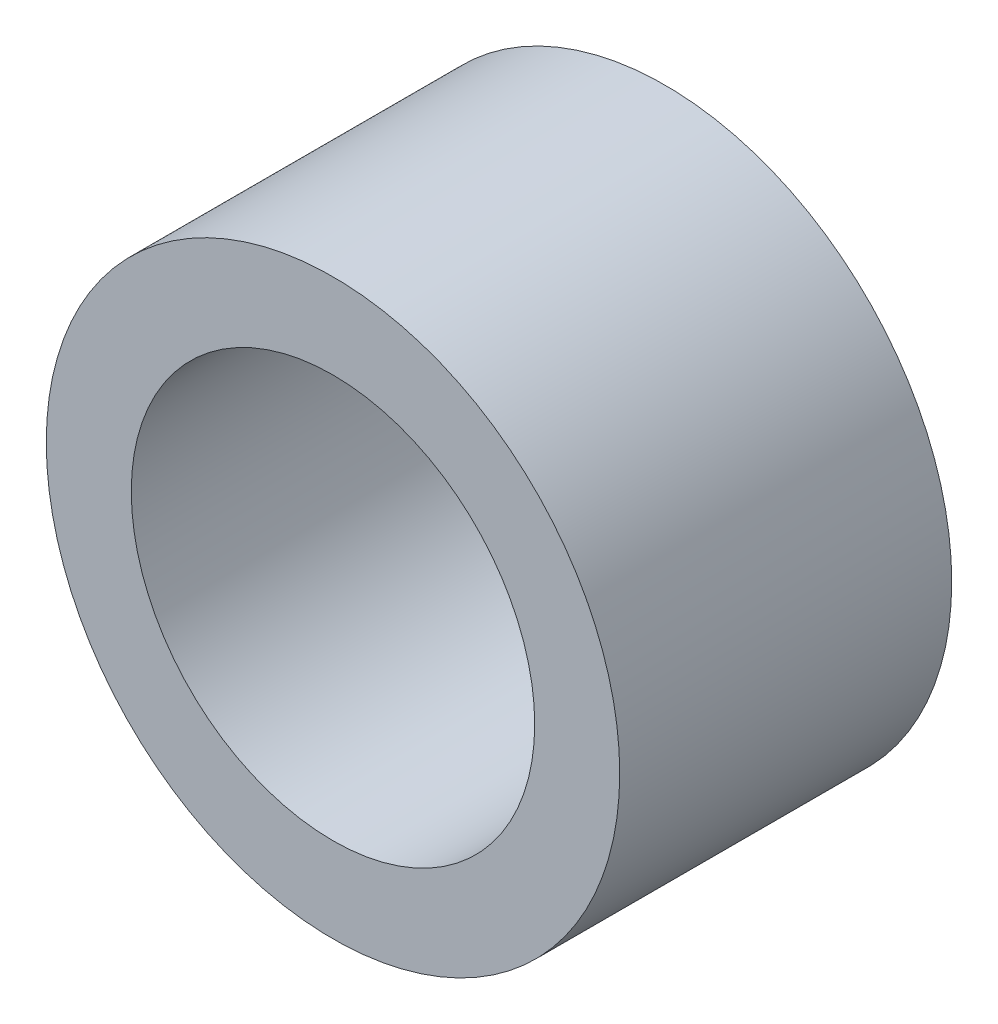
ISO-10303-21;
HEADER;
FILE_DESCRIPTION(('STEP AP214'),'2;1');
FILE_NAME('part.step','',(''),(''),'','','');
FILE_SCHEMA(('AUTOMOTIVE_DESIGN { 1 0 10303 214 1 1 1 1 }'));
ENDSEC;
DATA;
#1=APPLICATION_CONTEXT('core data for automotive mechanical design processes');
#2=APPLICATION_PROTOCOL_DEFINITION('international standard','automotive_design',2000,#1);
#3=PRODUCT_CONTEXT('',#1,'mechanical');
#4=PRODUCT('Part','Part','',(#3));
#5=PRODUCT_RELATED_PRODUCT_CATEGORY('part','',(#4));
#6=PRODUCT_DEFINITION_FORMATION('','',#4);
#7=PRODUCT_DEFINITION_CONTEXT('part definition',#1,'design');
#8=PRODUCT_DEFINITION('design','',#6,#7);
#9=PRODUCT_DEFINITION_SHAPE('','',#8);
#10=(LENGTH_UNIT() NAMED_UNIT(*) SI_UNIT(.MILLI.,.METRE.));
#11=(NAMED_UNIT(*) PLANE_ANGLE_UNIT() SI_UNIT($,.RADIAN.));
#12=(NAMED_UNIT(*) SI_UNIT($,.STERADIAN.) SOLID_ANGLE_UNIT());
#13=UNCERTAINTY_MEASURE_WITH_UNIT(LENGTH_MEASURE(1.E-05),#10,'distance_accuracy_value','');
#14=(GEOMETRIC_REPRESENTATION_CONTEXT(3) GLOBAL_UNCERTAINTY_ASSIGNED_CONTEXT((#13)) GLOBAL_UNIT_ASSIGNED_CONTEXT((#10,
#11,#12)) REPRESENTATION_CONTEXT('',''));
#15=CARTESIAN_POINT('',(0.,0.,0.));
#16=DIRECTION('',(0.,0.,1.));
#17=DIRECTION('',(1.,0.,0.));
#18=AXIS2_PLACEMENT_3D('',#15,#16,#17);
#19=CARTESIAN_POINT('',(0.,0.,33.));
#20=DIRECTION('',(0.,0.,1.));
#21=DIRECTION('',(1.,0.,0.));
#22=AXIS2_PLACEMENT_3D('',#19,#20,#21);
#23=PLANE('',#22);
#24=CARTESIAN_POINT('',(0.,0.,33.));
#25=DIRECTION('',(0.,0.,1.));
#26=DIRECTION('',(1.,0.,0.));
#27=AXIS2_PLACEMENT_3D('',#24,#25,#26);
#28=CIRCLE('',#27,28.5);
#29=CARTESIAN_POINT('',(28.5,0.,33.));
#30=VERTEX_POINT('',#29);
#31=EDGE_CURVE('E10',#30,#30,#28,.T.);
#32=ORIENTED_EDGE('',*,*,#31,.T.);
#33=EDGE_LOOP('',(#32));
#34=FACE_BOUND('',#33,.T.);
#35=CARTESIAN_POINT('',(0.,0.,33.));
#36=DIRECTION('',(0.,0.,1.));
#37=DIRECTION('',(1.,0.,0.));
#38=AXIS2_PLACEMENT_3D('',#35,#36,#37);
#39=CIRCLE('',#38,20.05);
#40=CARTESIAN_POINT('',(20.05,0.,33.));
#41=VERTEX_POINT('',#40);
#42=EDGE_CURVE('E57',#41,#41,#39,.T.);
#43=ORIENTED_EDGE('',*,*,#42,.F.);
#44=EDGE_LOOP('',(#43));
#45=FACE_BOUND('',#44,.T.);
#46=ADVANCED_FACE('F43',(#34,#45),#23,.T.);
#47=CARTESIAN_POINT('',(0.,0.,0.));
#48=DIRECTION('',(0.,0.,1.));
#49=DIRECTION('',(1.,0.,0.));
#50=AXIS2_PLACEMENT_3D('',#47,#48,#49);
#51=PLANE('',#50);
#52=CARTESIAN_POINT('',(0.,0.,0.));
#53=DIRECTION('',(0.,0.,1.));
#54=DIRECTION('',(1.,0.,0.));
#55=AXIS2_PLACEMENT_3D('',#52,#53,#54);
#56=CIRCLE('',#55,28.5);
#57=CARTESIAN_POINT('',(28.5,0.,0.));
#58=VERTEX_POINT('',#57);
#59=EDGE_CURVE('E47',#58,#58,#56,.T.);
#60=ORIENTED_EDGE('',*,*,#59,.F.);
#61=EDGE_LOOP('',(#60));
#62=FACE_BOUND('',#61,.T.);
#63=CARTESIAN_POINT('',(0.,0.,0.));
#64=DIRECTION('',(0.,0.,1.));
#65=DIRECTION('',(1.,0.,0.));
#66=AXIS2_PLACEMENT_3D('',#63,#64,#65);
#67=CIRCLE('',#66,20.05);
#68=CARTESIAN_POINT('',(20.05,0.,0.));
#69=VERTEX_POINT('',#68);
#70=EDGE_CURVE('E59',#69,#69,#67,.T.);
#71=ORIENTED_EDGE('',*,*,#70,.T.);
#72=EDGE_LOOP('',(#71));
#73=FACE_BOUND('',#72,.T.);
#74=ADVANCED_FACE('F70',(#62,#73),#51,.F.);
#75=CARTESIAN_POINT('',(0.,0.,33.));
#76=DIRECTION('',(0.,0.,-1.));
#77=DIRECTION('',(-1.,0.,0.));
#78=AXIS2_PLACEMENT_3D('',#75,#76,#77);
#79=CYLINDRICAL_SURFACE('',#78,28.5);
#80=ORIENTED_EDGE('',*,*,#31,.F.);
#81=EDGE_LOOP('',(#80));
#82=FACE_BOUND('',#81,.T.);
#83=ORIENTED_EDGE('',*,*,#59,.T.);
#84=EDGE_LOOP('',(#83));
#85=FACE_BOUND('',#84,.T.);
#86=ADVANCED_FACE('F45',(#82,#85),#79,.T.);
#87=CARTESIAN_POINT('',(0.,0.,33.));
#88=DIRECTION('',(0.,0.,-1.));
#89=DIRECTION('',(-1.,0.,0.));
#90=AXIS2_PLACEMENT_3D('',#87,#88,#89);
#91=CYLINDRICAL_SURFACE('',#90,20.05);
#92=ORIENTED_EDGE('',*,*,#42,.T.);
#93=EDGE_LOOP('',(#92));
#94=FACE_BOUND('',#93,.T.);
#95=ORIENTED_EDGE('',*,*,#70,.F.);
#96=EDGE_LOOP('',(#95));
#97=FACE_BOUND('',#96,.T.);
#98=ADVANCED_FACE('F66',(#94,#97),#91,.F.);
#99=CLOSED_SHELL('',(#46,#74,#86,#98));
#100=MANIFOLD_SOLID_BREP('B2',#99);
#101=ADVANCED_BREP_SHAPE_REPRESENTATION('',(#18,#100),#14);
#102=SHAPE_DEFINITION_REPRESENTATION(#9,#101);
ENDSEC;
END-ISO-10303-21;
